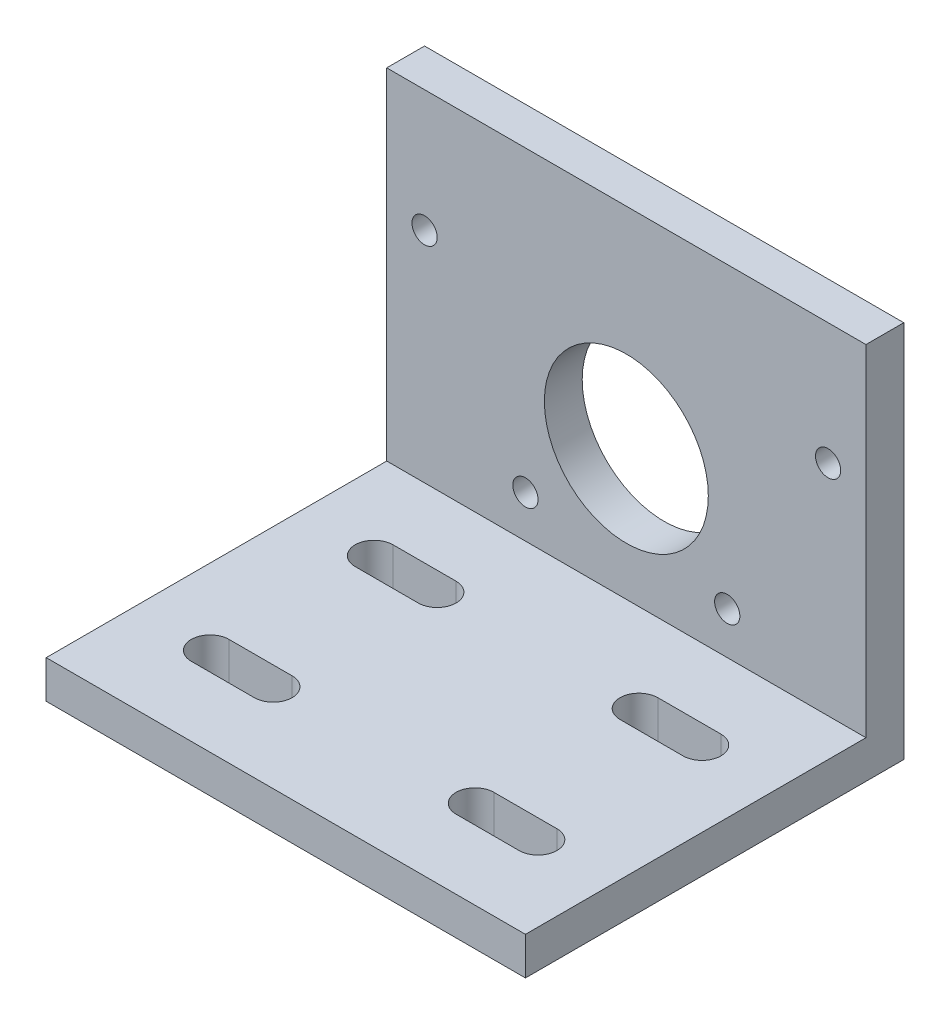
ISO-10303-21;
HEADER;
FILE_DESCRIPTION(('STEP AP214'),'2;1');
FILE_NAME('part.step','',(''),(''),'','','');
FILE_SCHEMA(('AUTOMOTIVE_DESIGN { 1 0 10303 214 1 1 1 1 }'));
ENDSEC;
DATA;
#1=APPLICATION_CONTEXT('core data for automotive mechanical design processes');
#2=APPLICATION_PROTOCOL_DEFINITION('international standard','automotive_design',2000,#1);
#3=PRODUCT_CONTEXT('',#1,'mechanical');
#4=PRODUCT('Part','Part','',(#3));
#5=PRODUCT_RELATED_PRODUCT_CATEGORY('part','',(#4));
#6=PRODUCT_DEFINITION_FORMATION('','',#4);
#7=PRODUCT_DEFINITION_CONTEXT('part definition',#1,'design');
#8=PRODUCT_DEFINITION('design','',#6,#7);
#9=PRODUCT_DEFINITION_SHAPE('','',#8);
#10=(LENGTH_UNIT() NAMED_UNIT(*) SI_UNIT(.MILLI.,.METRE.));
#11=(NAMED_UNIT(*) PLANE_ANGLE_UNIT() SI_UNIT($,.RADIAN.));
#12=(NAMED_UNIT(*) SI_UNIT($,.STERADIAN.) SOLID_ANGLE_UNIT());
#13=UNCERTAINTY_MEASURE_WITH_UNIT(LENGTH_MEASURE(1.E-05),#10,'distance_accuracy_value','');
#14=(GEOMETRIC_REPRESENTATION_CONTEXT(3) GLOBAL_UNCERTAINTY_ASSIGNED_CONTEXT((#13)) GLOBAL_UNIT_ASSIGNED_CONTEXT((#10,
#11,#12)) REPRESENTATION_CONTEXT('',''));
#15=CARTESIAN_POINT('',(0.,0.,0.));
#16=DIRECTION('',(0.,0.,1.));
#17=DIRECTION('',(1.,0.,0.));
#18=AXIS2_PLACEMENT_3D('',#15,#16,#17);
#19=CARTESIAN_POINT('',(19.,3.,-15.));
#20=DIRECTION('',(-1.,0.,0.));
#21=DIRECTION('',(0.,0.,1.));
#22=AXIS2_PLACEMENT_3D('',#19,#20,#21);
#23=PLANE('',#22);
#24=DIRECTION('',(0.,0.,-1.));
#25=VECTOR('',#24,1.);
#26=CARTESIAN_POINT('',(19.,0.,-15.));
#27=LINE('',#26,#25);
#28=CARTESIAN_POINT('',(19.,0.,15.));
#29=VERTEX_POINT('',#28);
#30=CARTESIAN_POINT('',(19.,0.,-15.));
#31=VERTEX_POINT('',#30);
#32=EDGE_CURVE('E404',#29,#31,#27,.T.);
#33=ORIENTED_EDGE('',*,*,#32,.T.);
#34=DIRECTION('',(0.,-1.,0.));
#35=VECTOR('',#34,1.);
#36=CARTESIAN_POINT('',(19.,3.,-15.));
#37=LINE('',#36,#35);
#38=CARTESIAN_POINT('',(19.,30.,-15.));
#39=VERTEX_POINT('',#38);
#40=EDGE_CURVE('E11',#39,#31,#37,.T.);
#41=ORIENTED_EDGE('',*,*,#40,.F.);
#42=DIRECTION('',(0.,0.,-1.));
#43=VECTOR('',#42,1.);
#44=CARTESIAN_POINT('',(19.,30.,-15.));
#45=LINE('',#44,#43);
#46=CARTESIAN_POINT('',(19.,30.,-12.));
#47=VERTEX_POINT('',#46);
#48=EDGE_CURVE('E385',#47,#39,#45,.T.);
#49=ORIENTED_EDGE('',*,*,#48,.F.);
#50=DIRECTION('',(0.,-1.,0.));
#51=VECTOR('',#50,1.);
#52=CARTESIAN_POINT('',(19.,30.,-12.));
#53=LINE('',#52,#51);
#54=CARTESIAN_POINT('',(19.,3.,-12.));
#55=VERTEX_POINT('',#54);
#56=EDGE_CURVE('E393',#47,#55,#53,.T.);
#57=ORIENTED_EDGE('',*,*,#56,.T.);
#58=DIRECTION('',(0.,0.,-1.));
#59=VECTOR('',#58,1.);
#60=CARTESIAN_POINT('',(19.,3.,-15.));
#61=LINE('',#60,#59);
#62=CARTESIAN_POINT('',(19.,3.,15.));
#63=VERTEX_POINT('',#62);
#64=EDGE_CURVE('E405',#63,#55,#61,.T.);
#65=ORIENTED_EDGE('',*,*,#64,.F.);
#66=DIRECTION('',(0.,-1.,0.));
#67=VECTOR('',#66,1.);
#68=CARTESIAN_POINT('',(19.,3.,15.));
#69=LINE('',#68,#67);
#70=EDGE_CURVE('E415',#63,#29,#69,.T.);
#71=ORIENTED_EDGE('',*,*,#70,.T.);
#72=EDGE_LOOP('',(#33,#41,#49,#57,#65,#71));
#73=FACE_BOUND('',#72,.T.);
#74=ADVANCED_FACE('F44',(#73),#23,.F.);
#75=CARTESIAN_POINT('',(-19.,3.,-15.));
#76=DIRECTION('',(0.,0.,1.));
#77=DIRECTION('',(1.,0.,0.));
#78=AXIS2_PLACEMENT_3D('',#75,#76,#77);
#79=PLANE('',#78);
#80=CARTESIAN_POINT('',(16.,20.35,-15.));
#81=DIRECTION('',(0.,0.,1.));
#82=DIRECTION('',(1.,0.,0.));
#83=AXIS2_PLACEMENT_3D('',#80,#81,#82);
#84=CIRCLE('',#83,1.);
#85=CARTESIAN_POINT('',(17.,20.35,-15.));
#86=VERTEX_POINT('',#85);
#87=EDGE_CURVE('E299',#86,#86,#84,.T.);
#88=ORIENTED_EDGE('',*,*,#87,.T.);
#89=EDGE_LOOP('',(#88));
#90=FACE_BOUND('',#89,.T.);
#91=CARTESIAN_POINT('',(-16.,20.35,-15.));
#92=DIRECTION('',(0.,0.,1.));
#93=DIRECTION('',(1.,0.,0.));
#94=AXIS2_PLACEMENT_3D('',#91,#92,#93);
#95=CIRCLE('',#94,1.);
#96=CARTESIAN_POINT('',(-15.,20.35,-15.));
#97=VERTEX_POINT('',#96);
#98=EDGE_CURVE('E576',#97,#97,#95,.T.);
#99=ORIENTED_EDGE('',*,*,#98,.T.);
#100=EDGE_LOOP('',(#99));
#101=FACE_BOUND('',#100,.T.);
#102=CARTESIAN_POINT('',(-8.,6.35,-15.));
#103=DIRECTION('',(0.,0.,1.));
#104=DIRECTION('',(1.,0.,0.));
#105=AXIS2_PLACEMENT_3D('',#102,#103,#104);
#106=CIRCLE('',#105,0.999999999999999);
#107=CARTESIAN_POINT('',(-7.,6.35,-15.));
#108=VERTEX_POINT('',#107);
#109=EDGE_CURVE('E586',#108,#108,#106,.T.);
#110=ORIENTED_EDGE('',*,*,#109,.T.);
#111=EDGE_LOOP('',(#110));
#112=FACE_BOUND('',#111,.T.);
#113=CARTESIAN_POINT('',(8.,6.35,-15.));
#114=DIRECTION('',(0.,0.,1.));
#115=DIRECTION('',(1.,0.,0.));
#116=AXIS2_PLACEMENT_3D('',#113,#114,#115);
#117=CIRCLE('',#116,1.);
#118=CARTESIAN_POINT('',(9.,6.35,-15.));
#119=VERTEX_POINT('',#118);
#120=EDGE_CURVE('E594',#119,#119,#117,.T.);
#121=ORIENTED_EDGE('',*,*,#120,.T.);
#122=EDGE_LOOP('',(#121));
#123=FACE_BOUND('',#122,.T.);
#124=CARTESIAN_POINT('',(0.,13.35,-15.));
#125=DIRECTION('',(0.,0.,1.));
#126=DIRECTION('',(1.,0.,0.));
#127=AXIS2_PLACEMENT_3D('',#124,#125,#126);
#128=CIRCLE('',#127,6.5);
#129=CARTESIAN_POINT('',(6.5,13.35,-15.));
#130=VERTEX_POINT('',#129);
#131=EDGE_CURVE('E373',#130,#130,#128,.T.);
#132=ORIENTED_EDGE('',*,*,#131,.T.);
#133=EDGE_LOOP('',(#132));
#134=FACE_BOUND('',#133,.T.);
#135=DIRECTION('',(-1.,0.,0.));
#136=VECTOR('',#135,1.);
#137=CARTESIAN_POINT('',(-19.,0.,-15.));
#138=LINE('',#137,#136);
#139=CARTESIAN_POINT('',(-19.,0.,-15.));
#140=VERTEX_POINT('',#139);
#141=EDGE_CURVE('E419',#31,#140,#138,.T.);
#142=ORIENTED_EDGE('',*,*,#141,.T.);
#143=DIRECTION('',(0.,-1.,0.));
#144=VECTOR('',#143,1.);
#145=CARTESIAN_POINT('',(-19.,3.,-15.));
#146=LINE('',#145,#144);
#147=CARTESIAN_POINT('',(-19.,30.,-15.));
#148=VERTEX_POINT('',#147);
#149=EDGE_CURVE('E52',#148,#140,#146,.T.);
#150=ORIENTED_EDGE('',*,*,#149,.F.);
#151=DIRECTION('',(-1.,0.,0.));
#152=VECTOR('',#151,1.);
#153=CARTESIAN_POINT('',(-19.,30.,-15.));
#154=LINE('',#153,#152);
#155=EDGE_CURVE('E389',#39,#148,#154,.T.);
#156=ORIENTED_EDGE('',*,*,#155,.F.);
#157=ORIENTED_EDGE('',*,*,#40,.T.);
#158=EDGE_LOOP('',(#142,#150,#156,#157));
#159=FACE_BOUND('',#158,.T.);
#160=ADVANCED_FACE('F461',(#90,#101,#112,#123,#134,#159),#79,.F.);
#161=CARTESIAN_POINT('',(-19.,3.,-15.));
#162=DIRECTION('',(1.,0.,0.));
#163=DIRECTION('',(0.,0.,-1.));
#164=AXIS2_PLACEMENT_3D('',#161,#162,#163);
#165=PLANE('',#164);
#166=DIRECTION('',(0.,0.,1.));
#167=VECTOR('',#166,1.);
#168=CARTESIAN_POINT('',(-19.,0.,-15.));
#169=LINE('',#168,#167);
#170=CARTESIAN_POINT('',(-19.,0.,15.));
#171=VERTEX_POINT('',#170);
#172=EDGE_CURVE('E422',#140,#171,#169,.T.);
#173=ORIENTED_EDGE('',*,*,#172,.T.);
#174=DIRECTION('',(0.,-1.,0.));
#175=VECTOR('',#174,1.);
#176=CARTESIAN_POINT('',(-19.,3.,15.));
#177=LINE('',#176,#175);
#178=CARTESIAN_POINT('',(-19.,3.,15.));
#179=VERTEX_POINT('',#178);
#180=EDGE_CURVE('E430',#179,#171,#177,.T.);
#181=ORIENTED_EDGE('',*,*,#180,.F.);
#182=DIRECTION('',(0.,0.,1.));
#183=VECTOR('',#182,1.);
#184=CARTESIAN_POINT('',(-19.,3.,-15.));
#185=LINE('',#184,#183);
#186=CARTESIAN_POINT('',(-19.,3.,-12.));
#187=VERTEX_POINT('',#186);
#188=EDGE_CURVE('E408',#187,#179,#185,.T.);
#189=ORIENTED_EDGE('',*,*,#188,.F.);
#190=DIRECTION('',(0.,-1.,0.));
#191=VECTOR('',#190,1.);
#192=CARTESIAN_POINT('',(-19.,30.,-12.));
#193=LINE('',#192,#191);
#194=CARTESIAN_POINT('',(-19.,30.,-12.));
#195=VERTEX_POINT('',#194);
#196=EDGE_CURVE('E400',#195,#187,#193,.T.);
#197=ORIENTED_EDGE('',*,*,#196,.F.);
#198=DIRECTION('',(0.,0.,1.));
#199=VECTOR('',#198,1.);
#200=CARTESIAN_POINT('',(-19.,30.,-15.));
#201=LINE('',#200,#199);
#202=EDGE_CURVE('E378',#148,#195,#201,.T.);
#203=ORIENTED_EDGE('',*,*,#202,.F.);
#204=ORIENTED_EDGE('',*,*,#149,.T.);
#205=EDGE_LOOP('',(#173,#181,#189,#197,#203,#204));
#206=FACE_BOUND('',#205,.T.);
#207=ADVANCED_FACE('F438',(#206),#165,.F.);
#208=CARTESIAN_POINT('',(-19.,3.,15.));
#209=DIRECTION('',(0.,0.,-1.));
#210=DIRECTION('',(-1.,0.,0.));
#211=AXIS2_PLACEMENT_3D('',#208,#209,#210);
#212=PLANE('',#211);
#213=DIRECTION('',(1.,0.,0.));
#214=VECTOR('',#213,1.);
#215=CARTESIAN_POINT('',(-19.,0.,15.));
#216=LINE('',#215,#214);
#217=EDGE_CURVE('E409',#171,#29,#216,.T.);
#218=ORIENTED_EDGE('',*,*,#217,.T.);
#219=ORIENTED_EDGE('',*,*,#70,.F.);
#220=DIRECTION('',(1.,0.,0.));
#221=VECTOR('',#220,1.);
#222=CARTESIAN_POINT('',(-19.,3.,15.));
#223=LINE('',#222,#221);
#224=EDGE_CURVE('E412',#179,#63,#223,.T.);
#225=ORIENTED_EDGE('',*,*,#224,.F.);
#226=ORIENTED_EDGE('',*,*,#180,.T.);
#227=EDGE_LOOP('',(#218,#219,#225,#226));
#228=FACE_BOUND('',#227,.T.);
#229=ADVANCED_FACE('F449',(#228),#212,.F.);
#230=CARTESIAN_POINT('',(0.,3.,0.));
#231=DIRECTION('',(0.,1.,0.));
#232=DIRECTION('',(0.,0.,1.));
#233=AXIS2_PLACEMENT_3D('',#230,#231,#232);
#234=PLANE('',#233);
#235=CARTESIAN_POINT('',(-13.,3.,8.));
#236=DIRECTION('',(0.,1.,0.));
#237=DIRECTION('',(0.,0.,1.));
#238=AXIS2_PLACEMENT_3D('',#235,#236,#237);
#239=CIRCLE('',#238,1.5);
#240=CARTESIAN_POINT('',(-13.,3.,6.5));
#241=VERTEX_POINT('',#240);
#242=CARTESIAN_POINT('',(-13.,3.,9.5));
#243=VERTEX_POINT('',#242);
#244=EDGE_CURVE('E59',#241,#243,#239,.T.);
#245=ORIENTED_EDGE('',*,*,#244,.F.);
#246=DIRECTION('',(-1.,0.,0.));
#247=VECTOR('',#246,1.);
#248=CARTESIAN_POINT('',(-13.,3.,6.5));
#249=LINE('',#248,#247);
#250=CARTESIAN_POINT('',(-8.,3.,6.5));
#251=VERTEX_POINT('',#250);
#252=EDGE_CURVE('E300',#251,#241,#249,.T.);
#253=ORIENTED_EDGE('',*,*,#252,.F.);
#254=CARTESIAN_POINT('',(-8.,3.,8.));
#255=DIRECTION('',(0.,1.,0.));
#256=DIRECTION('',(0.,0.,1.));
#257=AXIS2_PLACEMENT_3D('',#254,#255,#256);
#258=CIRCLE('',#257,1.5);
#259=CARTESIAN_POINT('',(-8.,3.,9.5));
#260=VERTEX_POINT('',#259);
#261=EDGE_CURVE('E304',#260,#251,#258,.T.);
#262=ORIENTED_EDGE('',*,*,#261,.F.);
#263=DIRECTION('',(1.,0.,0.));
#264=VECTOR('',#263,1.);
#265=CARTESIAN_POINT('',(-13.,3.,9.5));
#266=LINE('',#265,#264);
#267=EDGE_CURVE('E309',#243,#260,#266,.T.);
#268=ORIENTED_EDGE('',*,*,#267,.F.);
#269=EDGE_LOOP('',(#245,#253,#262,#268));
#270=FACE_BOUND('',#269,.T.);
#271=CARTESIAN_POINT('',(8.00000000000001,3.,8.));
#272=DIRECTION('',(0.,1.,0.));
#273=DIRECTION('',(0.,0.,1.));
#274=AXIS2_PLACEMENT_3D('',#271,#272,#273);
#275=CIRCLE('',#274,1.5);
#276=CARTESIAN_POINT('',(8.00000000000001,3.,6.5));
#277=VERTEX_POINT('',#276);
#278=CARTESIAN_POINT('',(8.00000000000001,3.,9.5));
#279=VERTEX_POINT('',#278);
#280=EDGE_CURVE('E67',#277,#279,#275,.T.);
#281=ORIENTED_EDGE('',*,*,#280,.F.);
#282=DIRECTION('',(-1.,0.,0.));
#283=VECTOR('',#282,1.);
#284=CARTESIAN_POINT('',(8.00000000000001,3.,6.5));
#285=LINE('',#284,#283);
#286=CARTESIAN_POINT('',(13.,3.,6.5));
#287=VERTEX_POINT('',#286);
#288=EDGE_CURVE('E257',#287,#277,#285,.T.);
#289=ORIENTED_EDGE('',*,*,#288,.F.);
#290=CARTESIAN_POINT('',(13.,3.,8.));
#291=DIRECTION('',(0.,1.,0.));
#292=DIRECTION('',(0.,0.,1.));
#293=AXIS2_PLACEMENT_3D('',#290,#291,#292);
#294=CIRCLE('',#293,1.5);
#295=CARTESIAN_POINT('',(13.,3.,9.5));
#296=VERTEX_POINT('',#295);
#297=EDGE_CURVE('E261',#296,#287,#294,.T.);
#298=ORIENTED_EDGE('',*,*,#297,.F.);
#299=DIRECTION('',(1.,0.,0.));
#300=VECTOR('',#299,1.);
#301=CARTESIAN_POINT('',(8.00000000000001,3.,9.5));
#302=LINE('',#301,#300);
#303=EDGE_CURVE('E266',#279,#296,#302,.T.);
#304=ORIENTED_EDGE('',*,*,#303,.F.);
#305=EDGE_LOOP('',(#281,#289,#298,#304));
#306=FACE_BOUND('',#305,.T.);
#307=CARTESIAN_POINT('',(8.00000000000001,3.,-5.));
#308=DIRECTION('',(0.,1.,0.));
#309=DIRECTION('',(0.,0.,1.));
#310=AXIS2_PLACEMENT_3D('',#307,#308,#309);
#311=CIRCLE('',#310,1.5);
#312=CARTESIAN_POINT('',(8.00000000000001,3.,-6.5));
#313=VERTEX_POINT('',#312);
#314=CARTESIAN_POINT('',(8.00000000000001,3.,-3.5));
#315=VERTEX_POINT('',#314);
#316=EDGE_CURVE('E196',#313,#315,#311,.T.);
#317=ORIENTED_EDGE('',*,*,#316,.F.);
#318=DIRECTION('',(-1.,0.,0.));
#319=VECTOR('',#318,1.);
#320=CARTESIAN_POINT('',(8.00000000000001,3.,-6.5));
#321=LINE('',#320,#319);
#322=CARTESIAN_POINT('',(13.,3.,-6.5));
#323=VERTEX_POINT('',#322);
#324=EDGE_CURVE('E207',#323,#313,#321,.T.);
#325=ORIENTED_EDGE('',*,*,#324,.F.);
#326=CARTESIAN_POINT('',(13.,3.,-5.));
#327=DIRECTION('',(0.,1.,0.));
#328=DIRECTION('',(0.,0.,1.));
#329=AXIS2_PLACEMENT_3D('',#326,#327,#328);
#330=CIRCLE('',#329,1.5);
#331=CARTESIAN_POINT('',(13.,3.,-3.5));
#332=VERTEX_POINT('',#331);
#333=EDGE_CURVE('E213',#332,#323,#330,.T.);
#334=ORIENTED_EDGE('',*,*,#333,.F.);
#335=DIRECTION('',(1.,0.,0.));
#336=VECTOR('',#335,1.);
#337=CARTESIAN_POINT('',(8.00000000000001,3.,-3.5));
#338=LINE('',#337,#336);
#339=EDGE_CURVE('E219',#315,#332,#338,.T.);
#340=ORIENTED_EDGE('',*,*,#339,.F.);
#341=EDGE_LOOP('',(#317,#325,#334,#340));
#342=FACE_BOUND('',#341,.T.);
#343=CARTESIAN_POINT('',(-13.,3.,-5.));
#344=DIRECTION('',(0.,1.,0.));
#345=DIRECTION('',(0.,0.,1.));
#346=AXIS2_PLACEMENT_3D('',#343,#344,#345);
#347=CIRCLE('',#346,1.5);
#348=CARTESIAN_POINT('',(-13.,3.,-6.5));
#349=VERTEX_POINT('',#348);
#350=CARTESIAN_POINT('',(-13.,3.,-3.5));
#351=VERTEX_POINT('',#350);
#352=EDGE_CURVE('E221',#349,#351,#347,.T.);
#353=ORIENTED_EDGE('',*,*,#352,.F.);
#354=DIRECTION('',(-1.,0.,0.));
#355=VECTOR('',#354,1.);
#356=CARTESIAN_POINT('',(-13.,3.,-6.5));
#357=LINE('',#356,#355);
#358=CARTESIAN_POINT('',(-8.,3.,-6.5));
#359=VERTEX_POINT('',#358);
#360=EDGE_CURVE('E334',#359,#349,#357,.T.);
#361=ORIENTED_EDGE('',*,*,#360,.F.);
#362=CARTESIAN_POINT('',(-8.,3.,-5.));
#363=DIRECTION('',(0.,1.,0.));
#364=DIRECTION('',(0.,0.,1.));
#365=AXIS2_PLACEMENT_3D('',#362,#363,#364);
#366=CIRCLE('',#365,1.5);
#367=CARTESIAN_POINT('',(-8.,3.,-3.5));
#368=VERTEX_POINT('',#367);
#369=EDGE_CURVE('E350',#368,#359,#366,.T.);
#370=ORIENTED_EDGE('',*,*,#369,.F.);
#371=DIRECTION('',(1.,0.,0.));
#372=VECTOR('',#371,1.);
#373=CARTESIAN_POINT('',(-13.,3.,-3.5));
#374=LINE('',#373,#372);
#375=EDGE_CURVE('E225',#351,#368,#374,.T.);
#376=ORIENTED_EDGE('',*,*,#375,.F.);
#377=EDGE_LOOP('',(#353,#361,#370,#376));
#378=FACE_BOUND('',#377,.T.);
#379=DIRECTION('',(1.,0.,0.));
#380=VECTOR('',#379,1.);
#381=CARTESIAN_POINT('',(-19.,3.,-12.));
#382=LINE('',#381,#380);
#383=EDGE_CURVE('E377',#187,#55,#382,.T.);
#384=ORIENTED_EDGE('',*,*,#383,.F.);
#385=ORIENTED_EDGE('',*,*,#188,.T.);
#386=ORIENTED_EDGE('',*,*,#224,.T.);
#387=ORIENTED_EDGE('',*,*,#64,.T.);
#388=EDGE_LOOP('',(#384,#385,#386,#387));
#389=FACE_BOUND('',#388,.T.);
#390=ADVANCED_FACE('F216',(#270,#306,#342,#378,#389),#234,.T.);
#391=CARTESIAN_POINT('',(0.,0.,0.));
#392=DIRECTION('',(0.,1.,0.));
#393=DIRECTION('',(0.,0.,1.));
#394=AXIS2_PLACEMENT_3D('',#391,#392,#393);
#395=PLANE('',#394);
#396=DIRECTION('',(-1.,0.,0.));
#397=VECTOR('',#396,1.);
#398=CARTESIAN_POINT('',(-13.,0.,6.5));
#399=LINE('',#398,#397);
#400=CARTESIAN_POINT('',(-8.,0.,6.5));
#401=VERTEX_POINT('',#400);
#402=CARTESIAN_POINT('',(-13.,0.,6.5));
#403=VERTEX_POINT('',#402);
#404=EDGE_CURVE('E289',#401,#403,#399,.T.);
#405=ORIENTED_EDGE('',*,*,#404,.T.);
#406=CARTESIAN_POINT('',(-13.,0.,8.));
#407=DIRECTION('',(0.,1.,0.));
#408=DIRECTION('',(0.,0.,1.));
#409=AXIS2_PLACEMENT_3D('',#406,#407,#408);
#410=CIRCLE('',#409,1.5);
#411=CARTESIAN_POINT('',(-13.,0.,9.5));
#412=VERTEX_POINT('',#411);
#413=EDGE_CURVE('E305',#403,#412,#410,.T.);
#414=ORIENTED_EDGE('',*,*,#413,.T.);
#415=DIRECTION('',(1.,0.,0.));
#416=VECTOR('',#415,1.);
#417=CARTESIAN_POINT('',(-13.,0.,9.5));
#418=LINE('',#417,#416);
#419=CARTESIAN_POINT('',(-8.,0.,9.5));
#420=VERTEX_POINT('',#419);
#421=EDGE_CURVE('E322',#412,#420,#418,.T.);
#422=ORIENTED_EDGE('',*,*,#421,.T.);
#423=CARTESIAN_POINT('',(-8.,0.,8.));
#424=DIRECTION('',(0.,1.,0.));
#425=DIRECTION('',(0.,0.,1.));
#426=AXIS2_PLACEMENT_3D('',#423,#424,#425);
#427=CIRCLE('',#426,1.5);
#428=EDGE_CURVE('E318',#420,#401,#427,.T.);
#429=ORIENTED_EDGE('',*,*,#428,.T.);
#430=EDGE_LOOP('',(#405,#414,#422,#429));
#431=FACE_BOUND('',#430,.T.);
#432=DIRECTION('',(-1.,0.,0.));
#433=VECTOR('',#432,1.);
#434=CARTESIAN_POINT('',(8.00000000000001,0.,6.5));
#435=LINE('',#434,#433);
#436=CARTESIAN_POINT('',(13.,0.,6.5));
#437=VERTEX_POINT('',#436);
#438=CARTESIAN_POINT('',(8.00000000000001,0.,6.5));
#439=VERTEX_POINT('',#438);
#440=EDGE_CURVE('E247',#437,#439,#435,.T.);
#441=ORIENTED_EDGE('',*,*,#440,.T.);
#442=CARTESIAN_POINT('',(8.00000000000001,0.,8.));
#443=DIRECTION('',(0.,1.,0.));
#444=DIRECTION('',(0.,0.,1.));
#445=AXIS2_PLACEMENT_3D('',#442,#443,#444);
#446=CIRCLE('',#445,1.5);
#447=CARTESIAN_POINT('',(8.00000000000001,0.,9.5));
#448=VERTEX_POINT('',#447);
#449=EDGE_CURVE('E262',#439,#448,#446,.T.);
#450=ORIENTED_EDGE('',*,*,#449,.T.);
#451=DIRECTION('',(1.,0.,0.));
#452=VECTOR('',#451,1.);
#453=CARTESIAN_POINT('',(8.00000000000001,0.,9.5));
#454=LINE('',#453,#452);
#455=CARTESIAN_POINT('',(13.,0.,9.5));
#456=VERTEX_POINT('',#455);
#457=EDGE_CURVE('E279',#448,#456,#454,.T.);
#458=ORIENTED_EDGE('',*,*,#457,.T.);
#459=CARTESIAN_POINT('',(13.,0.,8.));
#460=DIRECTION('',(0.,1.,0.));
#461=DIRECTION('',(0.,0.,1.));
#462=AXIS2_PLACEMENT_3D('',#459,#460,#461);
#463=CIRCLE('',#462,1.5);
#464=EDGE_CURVE('E275',#456,#437,#463,.T.);
#465=ORIENTED_EDGE('',*,*,#464,.T.);
#466=EDGE_LOOP('',(#441,#450,#458,#465));
#467=FACE_BOUND('',#466,.T.);
#468=DIRECTION('',(-1.,0.,0.));
#469=VECTOR('',#468,1.);
#470=CARTESIAN_POINT('',(8.00000000000001,0.,-6.5));
#471=LINE('',#470,#469);
#472=CARTESIAN_POINT('',(13.,0.,-6.5));
#473=VERTEX_POINT('',#472);
#474=CARTESIAN_POINT('',(8.00000000000001,0.,-6.5));
#475=VERTEX_POINT('',#474);
#476=EDGE_CURVE('E230',#473,#475,#471,.T.);
#477=ORIENTED_EDGE('',*,*,#476,.T.);
#478=CARTESIAN_POINT('',(8.00000000000001,0.,-5.));
#479=DIRECTION('',(0.,1.,0.));
#480=DIRECTION('',(0.,0.,1.));
#481=AXIS2_PLACEMENT_3D('',#478,#479,#480);
#482=CIRCLE('',#481,1.5);
#483=CARTESIAN_POINT('',(8.00000000000001,0.,-3.5));
#484=VERTEX_POINT('',#483);
#485=EDGE_CURVE('E199',#475,#484,#482,.T.);
#486=ORIENTED_EDGE('',*,*,#485,.T.);
#487=DIRECTION('',(1.,0.,0.));
#488=VECTOR('',#487,1.);
#489=CARTESIAN_POINT('',(8.00000000000001,0.,-3.5));
#490=LINE('',#489,#488);
#491=CARTESIAN_POINT('',(13.,0.,-3.5));
#492=VERTEX_POINT('',#491);
#493=EDGE_CURVE('E238',#484,#492,#490,.T.);
#494=ORIENTED_EDGE('',*,*,#493,.T.);
#495=CARTESIAN_POINT('',(13.,0.,-5.));
#496=DIRECTION('',(0.,1.,0.));
#497=DIRECTION('',(0.,0.,1.));
#498=AXIS2_PLACEMENT_3D('',#495,#496,#497);
#499=CIRCLE('',#498,1.5);
#500=EDGE_CURVE('E233',#492,#473,#499,.T.);
#501=ORIENTED_EDGE('',*,*,#500,.T.);
#502=EDGE_LOOP('',(#477,#486,#494,#501));
#503=FACE_BOUND('',#502,.T.);
#504=DIRECTION('',(-1.,0.,0.));
#505=VECTOR('',#504,1.);
#506=CARTESIAN_POINT('',(-13.,0.,-6.5));
#507=LINE('',#506,#505);
#508=CARTESIAN_POINT('',(-8.,0.,-6.5));
#509=VERTEX_POINT('',#508);
#510=CARTESIAN_POINT('',(-13.,0.,-6.5));
#511=VERTEX_POINT('',#510);
#512=EDGE_CURVE('E342',#509,#511,#507,.T.);
#513=ORIENTED_EDGE('',*,*,#512,.T.);
#514=CARTESIAN_POINT('',(-13.,0.,-5.));
#515=DIRECTION('',(0.,1.,0.));
#516=DIRECTION('',(0.,0.,1.));
#517=AXIS2_PLACEMENT_3D('',#514,#515,#516);
#518=CIRCLE('',#517,1.5);
#519=CARTESIAN_POINT('',(-13.,0.,-3.5));
#520=VERTEX_POINT('',#519);
#521=EDGE_CURVE('E329',#511,#520,#518,.T.);
#522=ORIENTED_EDGE('',*,*,#521,.T.);
#523=DIRECTION('',(1.,0.,0.));
#524=VECTOR('',#523,1.);
#525=CARTESIAN_POINT('',(-13.,0.,-3.5));
#526=LINE('',#525,#524);
#527=CARTESIAN_POINT('',(-8.,0.,-3.5));
#528=VERTEX_POINT('',#527);
#529=EDGE_CURVE('E333',#520,#528,#526,.T.);
#530=ORIENTED_EDGE('',*,*,#529,.T.);
#531=CARTESIAN_POINT('',(-8.,0.,-5.));
#532=DIRECTION('',(0.,1.,0.));
#533=DIRECTION('',(0.,0.,1.));
#534=AXIS2_PLACEMENT_3D('',#531,#532,#533);
#535=CIRCLE('',#534,1.5);
#536=EDGE_CURVE('E338',#528,#509,#535,.T.);
#537=ORIENTED_EDGE('',*,*,#536,.T.);
#538=EDGE_LOOP('',(#513,#522,#530,#537));
#539=FACE_BOUND('',#538,.T.);
#540=ORIENTED_EDGE('',*,*,#32,.F.);
#541=ORIENTED_EDGE('',*,*,#217,.F.);
#542=ORIENTED_EDGE('',*,*,#172,.F.);
#543=ORIENTED_EDGE('',*,*,#141,.F.);
#544=EDGE_LOOP('',(#540,#541,#542,#543));
#545=FACE_BOUND('',#544,.T.);
#546=ADVANCED_FACE('F446',(#431,#467,#503,#539,#545),#395,.F.);
#547=CARTESIAN_POINT('',(-19.,30.,-12.));
#548=DIRECTION('',(0.,0.,-1.));
#549=DIRECTION('',(-1.,0.,0.));
#550=AXIS2_PLACEMENT_3D('',#547,#548,#549);
#551=PLANE('',#550);
#552=CARTESIAN_POINT('',(16.,20.35,-12.));
#553=DIRECTION('',(0.,0.,1.));
#554=DIRECTION('',(1.,0.,0.));
#555=AXIS2_PLACEMENT_3D('',#552,#553,#554);
#556=CIRCLE('',#555,1.);
#557=CARTESIAN_POINT('',(17.,20.35,-12.));
#558=VERTEX_POINT('',#557);
#559=EDGE_CURVE('E568',#558,#558,#556,.T.);
#560=ORIENTED_EDGE('',*,*,#559,.F.);
#561=EDGE_LOOP('',(#560));
#562=FACE_BOUND('',#561,.T.);
#563=CARTESIAN_POINT('',(-16.,20.35,-12.));
#564=DIRECTION('',(0.,0.,1.));
#565=DIRECTION('',(1.,0.,0.));
#566=AXIS2_PLACEMENT_3D('',#563,#564,#565);
#567=CIRCLE('',#566,1.);
#568=CARTESIAN_POINT('',(-15.,20.35,-12.));
#569=VERTEX_POINT('',#568);
#570=EDGE_CURVE('E570',#569,#569,#567,.T.);
#571=ORIENTED_EDGE('',*,*,#570,.F.);
#572=EDGE_LOOP('',(#571));
#573=FACE_BOUND('',#572,.T.);
#574=CARTESIAN_POINT('',(-8.,6.35,-12.));
#575=DIRECTION('',(0.,0.,1.));
#576=DIRECTION('',(1.,0.,0.));
#577=AXIS2_PLACEMENT_3D('',#574,#575,#576);
#578=CIRCLE('',#577,0.999999999999999);
#579=CARTESIAN_POINT('',(-7.,6.35,-12.));
#580=VERTEX_POINT('',#579);
#581=EDGE_CURVE('E582',#580,#580,#578,.T.);
#582=ORIENTED_EDGE('',*,*,#581,.F.);
#583=EDGE_LOOP('',(#582));
#584=FACE_BOUND('',#583,.T.);
#585=CARTESIAN_POINT('',(8.,6.35,-12.));
#586=DIRECTION('',(0.,0.,1.));
#587=DIRECTION('',(1.,0.,0.));
#588=AXIS2_PLACEMENT_3D('',#585,#586,#587);
#589=CIRCLE('',#588,1.);
#590=CARTESIAN_POINT('',(9.,6.35,-12.));
#591=VERTEX_POINT('',#590);
#592=EDGE_CURVE('E590',#591,#591,#589,.T.);
#593=ORIENTED_EDGE('',*,*,#592,.F.);
#594=EDGE_LOOP('',(#593));
#595=FACE_BOUND('',#594,.T.);
#596=CARTESIAN_POINT('',(0.,13.35,-12.));
#597=DIRECTION('',(0.,0.,1.));
#598=DIRECTION('',(1.,0.,0.));
#599=AXIS2_PLACEMENT_3D('',#596,#597,#598);
#600=CIRCLE('',#599,6.5);
#601=CARTESIAN_POINT('',(6.5,13.35,-12.));
#602=VERTEX_POINT('',#601);
#603=EDGE_CURVE('E360',#602,#602,#600,.T.);
#604=ORIENTED_EDGE('',*,*,#603,.F.);
#605=EDGE_LOOP('',(#604));
#606=FACE_BOUND('',#605,.T.);
#607=ORIENTED_EDGE('',*,*,#383,.T.);
#608=ORIENTED_EDGE('',*,*,#56,.F.);
#609=DIRECTION('',(1.,0.,0.));
#610=VECTOR('',#609,1.);
#611=CARTESIAN_POINT('',(-19.,30.,-12.));
#612=LINE('',#611,#610);
#613=EDGE_CURVE('E382',#195,#47,#612,.T.);
#614=ORIENTED_EDGE('',*,*,#613,.F.);
#615=ORIENTED_EDGE('',*,*,#196,.T.);
#616=EDGE_LOOP('',(#607,#608,#614,#615));
#617=FACE_BOUND('',#616,.T.);
#618=ADVANCED_FACE('F458',(#562,#573,#584,#595,#606,#617),#551,.F.);
#619=CARTESIAN_POINT('',(0.,30.,0.));
#620=DIRECTION('',(0.,1.,0.));
#621=DIRECTION('',(0.,0.,1.));
#622=AXIS2_PLACEMENT_3D('',#619,#620,#621);
#623=PLANE('',#622);
#624=ORIENTED_EDGE('',*,*,#202,.T.);
#625=ORIENTED_EDGE('',*,*,#613,.T.);
#626=ORIENTED_EDGE('',*,*,#48,.T.);
#627=ORIENTED_EDGE('',*,*,#155,.T.);
#628=EDGE_LOOP('',(#624,#625,#626,#627));
#629=FACE_BOUND('',#628,.T.);
#630=ADVANCED_FACE('F460',(#629),#623,.T.);
#631=CARTESIAN_POINT('',(0.,13.35,-39.));
#632=DIRECTION('',(0.,0.,1.));
#633=DIRECTION('',(1.,0.,0.));
#634=AXIS2_PLACEMENT_3D('',#631,#632,#633);
#635=CYLINDRICAL_SURFACE('',#634,6.5);
#636=ORIENTED_EDGE('',*,*,#603,.T.);
#637=EDGE_LOOP('',(#636));
#638=FACE_BOUND('',#637,.T.);
#639=ORIENTED_EDGE('',*,*,#131,.F.);
#640=EDGE_LOOP('',(#639));
#641=FACE_BOUND('',#640,.T.);
#642=ADVANCED_FACE('F486',(#638,#641),#635,.F.);
#643=CARTESIAN_POINT('',(-13.,0.,-5.));
#644=DIRECTION('',(0.,1.,0.));
#645=DIRECTION('',(0.,0.,1.));
#646=AXIS2_PLACEMENT_3D('',#643,#644,#645);
#647=CYLINDRICAL_SURFACE('',#646,1.5);
#648=ORIENTED_EDGE('',*,*,#352,.T.);
#649=DIRECTION('',(0.,1.,0.));
#650=VECTOR('',#649,1.);
#651=CARTESIAN_POINT('',(-13.,0.,-3.5));
#652=LINE('',#651,#650);
#653=EDGE_CURVE('E345',#520,#351,#652,.T.);
#654=ORIENTED_EDGE('',*,*,#653,.F.);
#655=ORIENTED_EDGE('',*,*,#521,.F.);
#656=DIRECTION('',(0.,1.,0.));
#657=VECTOR('',#656,1.);
#658=CARTESIAN_POINT('',(-13.,0.,-6.5));
#659=LINE('',#658,#657);
#660=EDGE_CURVE('E357',#511,#349,#659,.T.);
#661=ORIENTED_EDGE('',*,*,#660,.T.);
#662=EDGE_LOOP('',(#648,#654,#655,#661));
#663=FACE_BOUND('',#662,.T.);
#664=ADVANCED_FACE('F489',(#663),#647,.F.);
#665=CARTESIAN_POINT('',(-13.,0.,-6.5));
#666=DIRECTION('',(0.,0.,-1.));
#667=DIRECTION('',(-1.,0.,0.));
#668=AXIS2_PLACEMENT_3D('',#665,#666,#667);
#669=PLANE('',#668);
#670=ORIENTED_EDGE('',*,*,#360,.T.);
#671=ORIENTED_EDGE('',*,*,#660,.F.);
#672=ORIENTED_EDGE('',*,*,#512,.F.);
#673=DIRECTION('',(0.,1.,0.));
#674=VECTOR('',#673,1.);
#675=CARTESIAN_POINT('',(-8.,0.,-6.5));
#676=LINE('',#675,#674);
#677=EDGE_CURVE('E361',#509,#359,#676,.T.);
#678=ORIENTED_EDGE('',*,*,#677,.T.);
#679=EDGE_LOOP('',(#670,#671,#672,#678));
#680=FACE_BOUND('',#679,.T.);
#681=ADVANCED_FACE('F493',(#680),#669,.F.);
#682=CARTESIAN_POINT('',(-8.,0.,-5.));
#683=DIRECTION('',(0.,1.,0.));
#684=DIRECTION('',(0.,0.,1.));
#685=AXIS2_PLACEMENT_3D('',#682,#683,#684);
#686=CYLINDRICAL_SURFACE('',#685,1.5);
#687=ORIENTED_EDGE('',*,*,#369,.T.);
#688=ORIENTED_EDGE('',*,*,#677,.F.);
#689=ORIENTED_EDGE('',*,*,#536,.F.);
#690=DIRECTION('',(0.,1.,0.));
#691=VECTOR('',#690,1.);
#692=CARTESIAN_POINT('',(-8.,0.,-3.5));
#693=LINE('',#692,#691);
#694=EDGE_CURVE('E364',#528,#368,#693,.T.);
#695=ORIENTED_EDGE('',*,*,#694,.T.);
#696=EDGE_LOOP('',(#687,#688,#689,#695));
#697=FACE_BOUND('',#696,.T.);
#698=ADVANCED_FACE('F498',(#697),#686,.F.);
#699=CARTESIAN_POINT('',(-13.,0.,-3.5));
#700=DIRECTION('',(0.,0.,1.));
#701=DIRECTION('',(1.,0.,0.));
#702=AXIS2_PLACEMENT_3D('',#699,#700,#701);
#703=PLANE('',#702);
#704=ORIENTED_EDGE('',*,*,#375,.T.);
#705=ORIENTED_EDGE('',*,*,#694,.F.);
#706=ORIENTED_EDGE('',*,*,#529,.F.);
#707=ORIENTED_EDGE('',*,*,#653,.T.);
#708=EDGE_LOOP('',(#704,#705,#706,#707));
#709=FACE_BOUND('',#708,.T.);
#710=ADVANCED_FACE('F495',(#709),#703,.F.);
#711=CARTESIAN_POINT('',(8.00000000000001,0.,-5.));
#712=DIRECTION('',(0.,1.,0.));
#713=DIRECTION('',(0.,0.,1.));
#714=AXIS2_PLACEMENT_3D('',#711,#712,#713);
#715=CYLINDRICAL_SURFACE('',#714,1.5);
#716=ORIENTED_EDGE('',*,*,#316,.T.);
#717=DIRECTION('',(0.,1.,0.));
#718=VECTOR('',#717,1.);
#719=CARTESIAN_POINT('',(8.00000000000001,0.,-3.5));
#720=LINE('',#719,#718);
#721=EDGE_CURVE('E234',#484,#315,#720,.T.);
#722=ORIENTED_EDGE('',*,*,#721,.F.);
#723=ORIENTED_EDGE('',*,*,#485,.F.);
#724=DIRECTION('',(0.,1.,0.));
#725=VECTOR('',#724,1.);
#726=CARTESIAN_POINT('',(8.00000000000001,0.,-6.5));
#727=LINE('',#726,#725);
#728=EDGE_CURVE('E192',#475,#313,#727,.T.);
#729=ORIENTED_EDGE('',*,*,#728,.T.);
#730=EDGE_LOOP('',(#716,#722,#723,#729));
#731=FACE_BOUND('',#730,.T.);
#732=ADVANCED_FACE('F194',(#731),#715,.F.);
#733=CARTESIAN_POINT('',(8.00000000000001,0.,-6.5));
#734=DIRECTION('',(0.,0.,-1.));
#735=DIRECTION('',(-1.,0.,0.));
#736=AXIS2_PLACEMENT_3D('',#733,#734,#735);
#737=PLANE('',#736);
#738=ORIENTED_EDGE('',*,*,#324,.T.);
#739=ORIENTED_EDGE('',*,*,#728,.F.);
#740=ORIENTED_EDGE('',*,*,#476,.F.);
#741=DIRECTION('',(0.,1.,0.));
#742=VECTOR('',#741,1.);
#743=CARTESIAN_POINT('',(13.,0.,-6.5));
#744=LINE('',#743,#742);
#745=EDGE_CURVE('E204',#473,#323,#744,.T.);
#746=ORIENTED_EDGE('',*,*,#745,.T.);
#747=EDGE_LOOP('',(#738,#739,#740,#746));
#748=FACE_BOUND('',#747,.T.);
#749=ADVANCED_FACE('F208',(#748),#737,.F.);
#750=CARTESIAN_POINT('',(13.,0.,-5.));
#751=DIRECTION('',(0.,1.,0.));
#752=DIRECTION('',(0.,0.,1.));
#753=AXIS2_PLACEMENT_3D('',#750,#751,#752);
#754=CYLINDRICAL_SURFACE('',#753,1.5);
#755=ORIENTED_EDGE('',*,*,#333,.T.);
#756=ORIENTED_EDGE('',*,*,#745,.F.);
#757=ORIENTED_EDGE('',*,*,#500,.F.);
#758=DIRECTION('',(0.,1.,0.));
#759=VECTOR('',#758,1.);
#760=CARTESIAN_POINT('',(13.,0.,-3.5));
#761=LINE('',#760,#759);
#762=EDGE_CURVE('E600',#492,#332,#761,.T.);
#763=ORIENTED_EDGE('',*,*,#762,.T.);
#764=EDGE_LOOP('',(#755,#756,#757,#763));
#765=FACE_BOUND('',#764,.T.);
#766=ADVANCED_FACE('F539',(#765),#754,.F.);
#767=CARTESIAN_POINT('',(8.00000000000001,0.,-3.5));
#768=DIRECTION('',(0.,0.,1.));
#769=DIRECTION('',(1.,0.,0.));
#770=AXIS2_PLACEMENT_3D('',#767,#768,#769);
#771=PLANE('',#770);
#772=ORIENTED_EDGE('',*,*,#339,.T.);
#773=ORIENTED_EDGE('',*,*,#762,.F.);
#774=ORIENTED_EDGE('',*,*,#493,.F.);
#775=ORIENTED_EDGE('',*,*,#721,.T.);
#776=EDGE_LOOP('',(#772,#773,#774,#775));
#777=FACE_BOUND('',#776,.T.);
#778=ADVANCED_FACE('F536',(#777),#771,.F.);
#779=CARTESIAN_POINT('',(8.00000000000001,0.,8.));
#780=DIRECTION('',(0.,1.,0.));
#781=DIRECTION('',(0.,0.,1.));
#782=AXIS2_PLACEMENT_3D('',#779,#780,#781);
#783=CYLINDRICAL_SURFACE('',#782,1.5);
#784=ORIENTED_EDGE('',*,*,#280,.T.);
#785=DIRECTION('',(0.,1.,0.));
#786=VECTOR('',#785,1.);
#787=CARTESIAN_POINT('',(8.00000000000001,0.,9.5));
#788=LINE('',#787,#786);
#789=EDGE_CURVE('E244',#448,#279,#788,.T.);
#790=ORIENTED_EDGE('',*,*,#789,.F.);
#791=ORIENTED_EDGE('',*,*,#449,.F.);
#792=DIRECTION('',(0.,1.,0.));
#793=VECTOR('',#792,1.);
#794=CARTESIAN_POINT('',(8.00000000000001,0.,6.5));
#795=LINE('',#794,#793);
#796=EDGE_CURVE('E254',#439,#277,#795,.T.);
#797=ORIENTED_EDGE('',*,*,#796,.T.);
#798=EDGE_LOOP('',(#784,#790,#791,#797));
#799=FACE_BOUND('',#798,.T.);
#800=ADVANCED_FACE('F526',(#799),#783,.F.);
#801=CARTESIAN_POINT('',(8.00000000000001,0.,6.5));
#802=DIRECTION('',(0.,0.,-1.));
#803=DIRECTION('',(-1.,0.,0.));
#804=AXIS2_PLACEMENT_3D('',#801,#802,#803);
#805=PLANE('',#804);
#806=ORIENTED_EDGE('',*,*,#288,.T.);
#807=ORIENTED_EDGE('',*,*,#796,.F.);
#808=ORIENTED_EDGE('',*,*,#440,.F.);
#809=DIRECTION('',(0.,1.,0.));
#810=VECTOR('',#809,1.);
#811=CARTESIAN_POINT('',(13.,0.,6.5));
#812=LINE('',#811,#810);
#813=EDGE_CURVE('E251',#437,#287,#812,.T.);
#814=ORIENTED_EDGE('',*,*,#813,.T.);
#815=EDGE_LOOP('',(#806,#807,#808,#814));
#816=FACE_BOUND('',#815,.T.);
#817=ADVANCED_FACE('F522',(#816),#805,.F.);
#818=CARTESIAN_POINT('',(13.,0.,8.));
#819=DIRECTION('',(0.,1.,0.));
#820=DIRECTION('',(0.,0.,1.));
#821=AXIS2_PLACEMENT_3D('',#818,#819,#820);
#822=CYLINDRICAL_SURFACE('',#821,1.5);
#823=ORIENTED_EDGE('',*,*,#297,.T.);
#824=ORIENTED_EDGE('',*,*,#813,.F.);
#825=ORIENTED_EDGE('',*,*,#464,.F.);
#826=DIRECTION('',(0.,1.,0.));
#827=VECTOR('',#826,1.);
#828=CARTESIAN_POINT('',(13.,0.,9.5));
#829=LINE('',#828,#827);
#830=EDGE_CURVE('E248',#456,#296,#829,.T.);
#831=ORIENTED_EDGE('',*,*,#830,.T.);
#832=EDGE_LOOP('',(#823,#824,#825,#831));
#833=FACE_BOUND('',#832,.T.);
#834=ADVANCED_FACE('F525',(#833),#822,.F.);
#835=CARTESIAN_POINT('',(8.00000000000001,0.,9.5));
#836=DIRECTION('',(0.,0.,1.));
#837=DIRECTION('',(1.,0.,0.));
#838=AXIS2_PLACEMENT_3D('',#835,#836,#837);
#839=PLANE('',#838);
#840=ORIENTED_EDGE('',*,*,#303,.T.);
#841=ORIENTED_EDGE('',*,*,#830,.F.);
#842=ORIENTED_EDGE('',*,*,#457,.F.);
#843=ORIENTED_EDGE('',*,*,#789,.T.);
#844=EDGE_LOOP('',(#840,#841,#842,#843));
#845=FACE_BOUND('',#844,.T.);
#846=ADVANCED_FACE('F521',(#845),#839,.F.);
#847=CARTESIAN_POINT('',(-13.,0.,8.));
#848=DIRECTION('',(0.,1.,0.));
#849=DIRECTION('',(0.,0.,1.));
#850=AXIS2_PLACEMENT_3D('',#847,#848,#849);
#851=CYLINDRICAL_SURFACE('',#850,1.5);
#852=ORIENTED_EDGE('',*,*,#244,.T.);
#853=DIRECTION('',(0.,1.,0.));
#854=VECTOR('',#853,1.);
#855=CARTESIAN_POINT('',(-13.,0.,9.5));
#856=LINE('',#855,#854);
#857=EDGE_CURVE('E286',#412,#243,#856,.T.);
#858=ORIENTED_EDGE('',*,*,#857,.F.);
#859=ORIENTED_EDGE('',*,*,#413,.F.);
#860=DIRECTION('',(0.,1.,0.));
#861=VECTOR('',#860,1.);
#862=CARTESIAN_POINT('',(-13.,0.,6.5));
#863=LINE('',#862,#861);
#864=EDGE_CURVE('E296',#403,#241,#863,.T.);
#865=ORIENTED_EDGE('',*,*,#864,.T.);
#866=EDGE_LOOP('',(#852,#858,#859,#865));
#867=FACE_BOUND('',#866,.T.);
#868=ADVANCED_FACE('F510',(#867),#851,.F.);
#869=CARTESIAN_POINT('',(-13.,0.,6.5));
#870=DIRECTION('',(0.,0.,-1.));
#871=DIRECTION('',(-1.,0.,0.));
#872=AXIS2_PLACEMENT_3D('',#869,#870,#871);
#873=PLANE('',#872);
#874=ORIENTED_EDGE('',*,*,#252,.T.);
#875=ORIENTED_EDGE('',*,*,#864,.F.);
#876=ORIENTED_EDGE('',*,*,#404,.F.);
#877=DIRECTION('',(0.,1.,0.));
#878=VECTOR('',#877,1.);
#879=CARTESIAN_POINT('',(-8.,0.,6.5));
#880=LINE('',#879,#878);
#881=EDGE_CURVE('E293',#401,#251,#880,.T.);
#882=ORIENTED_EDGE('',*,*,#881,.T.);
#883=EDGE_LOOP('',(#874,#875,#876,#882));
#884=FACE_BOUND('',#883,.T.);
#885=ADVANCED_FACE('F506',(#884),#873,.F.);
#886=CARTESIAN_POINT('',(-8.,0.,8.));
#887=DIRECTION('',(0.,1.,0.));
#888=DIRECTION('',(0.,0.,1.));
#889=AXIS2_PLACEMENT_3D('',#886,#887,#888);
#890=CYLINDRICAL_SURFACE('',#889,1.5);
#891=ORIENTED_EDGE('',*,*,#261,.T.);
#892=ORIENTED_EDGE('',*,*,#881,.F.);
#893=ORIENTED_EDGE('',*,*,#428,.F.);
#894=DIRECTION('',(0.,1.,0.));
#895=VECTOR('',#894,1.);
#896=CARTESIAN_POINT('',(-8.,0.,9.5));
#897=LINE('',#896,#895);
#898=EDGE_CURVE('E290',#420,#260,#897,.T.);
#899=ORIENTED_EDGE('',*,*,#898,.T.);
#900=EDGE_LOOP('',(#891,#892,#893,#899));
#901=FACE_BOUND('',#900,.T.);
#902=ADVANCED_FACE('F509',(#901),#890,.F.);
#903=CARTESIAN_POINT('',(-13.,0.,9.5));
#904=DIRECTION('',(0.,0.,1.));
#905=DIRECTION('',(1.,0.,0.));
#906=AXIS2_PLACEMENT_3D('',#903,#904,#905);
#907=PLANE('',#906);
#908=ORIENTED_EDGE('',*,*,#267,.T.);
#909=ORIENTED_EDGE('',*,*,#898,.F.);
#910=ORIENTED_EDGE('',*,*,#421,.F.);
#911=ORIENTED_EDGE('',*,*,#857,.T.);
#912=EDGE_LOOP('',(#908,#909,#910,#911));
#913=FACE_BOUND('',#912,.T.);
#914=ADVANCED_FACE('F514',(#913),#907,.F.);
#915=CARTESIAN_POINT('',(8.,6.35,-15.));
#916=DIRECTION('',(0.,0.,1.));
#917=DIRECTION('',(1.,0.,0.));
#918=AXIS2_PLACEMENT_3D('',#915,#916,#917);
#919=CYLINDRICAL_SURFACE('',#918,1.);
#920=ORIENTED_EDGE('',*,*,#120,.F.);
#921=EDGE_LOOP('',(#920));
#922=FACE_BOUND('',#921,.T.);
#923=ORIENTED_EDGE('',*,*,#592,.T.);
#924=EDGE_LOOP('',(#923));
#925=FACE_BOUND('',#924,.T.);
#926=ADVANCED_FACE('F517',(#922,#925),#919,.F.);
#927=CARTESIAN_POINT('',(-8.,6.35,-15.));
#928=DIRECTION('',(0.,0.,1.));
#929=DIRECTION('',(1.,0.,0.));
#930=AXIS2_PLACEMENT_3D('',#927,#928,#929);
#931=CYLINDRICAL_SURFACE('',#930,0.999999999999999);
#932=ORIENTED_EDGE('',*,*,#109,.F.);
#933=EDGE_LOOP('',(#932));
#934=FACE_BOUND('',#933,.T.);
#935=ORIENTED_EDGE('',*,*,#581,.T.);
#936=EDGE_LOOP('',(#935));
#937=FACE_BOUND('',#936,.T.);
#938=ADVANCED_FACE('F550',(#934,#937),#931,.F.);
#939=CARTESIAN_POINT('',(-16.,20.35,-15.));
#940=DIRECTION('',(0.,0.,1.));
#941=DIRECTION('',(1.,0.,0.));
#942=AXIS2_PLACEMENT_3D('',#939,#940,#941);
#943=CYLINDRICAL_SURFACE('',#942,1.);
#944=ORIENTED_EDGE('',*,*,#98,.F.);
#945=EDGE_LOOP('',(#944));
#946=FACE_BOUND('',#945,.T.);
#947=ORIENTED_EDGE('',*,*,#570,.T.);
#948=EDGE_LOOP('',(#947));
#949=FACE_BOUND('',#948,.T.);
#950=ADVANCED_FACE('F554',(#946,#949),#943,.F.);
#951=CARTESIAN_POINT('',(16.,20.35,-15.));
#952=DIRECTION('',(0.,0.,1.));
#953=DIRECTION('',(1.,0.,0.));
#954=AXIS2_PLACEMENT_3D('',#951,#952,#953);
#955=CYLINDRICAL_SURFACE('',#954,1.);
#956=ORIENTED_EDGE('',*,*,#87,.F.);
#957=EDGE_LOOP('',(#956));
#958=FACE_BOUND('',#957,.T.);
#959=ORIENTED_EDGE('',*,*,#559,.T.);
#960=EDGE_LOOP('',(#959));
#961=FACE_BOUND('',#960,.T.);
#962=ADVANCED_FACE('F558',(#958,#961),#955,.F.);
#963=CLOSED_SHELL('',(#74,#160,#207,#229,#390,#546,#618,#630,#642,#664,#681,#698,#710,#732,#749,
#766,#778,#800,#817,#834,#846,#868,#885,#902,#914,#926,#938,#950,#962));
#964=MANIFOLD_SOLID_BREP('B2',#963);
#965=ADVANCED_BREP_SHAPE_REPRESENTATION('',(#18,#964),#14);
#966=SHAPE_DEFINITION_REPRESENTATION(#9,#965);
ENDSEC;
END-ISO-10303-21;
